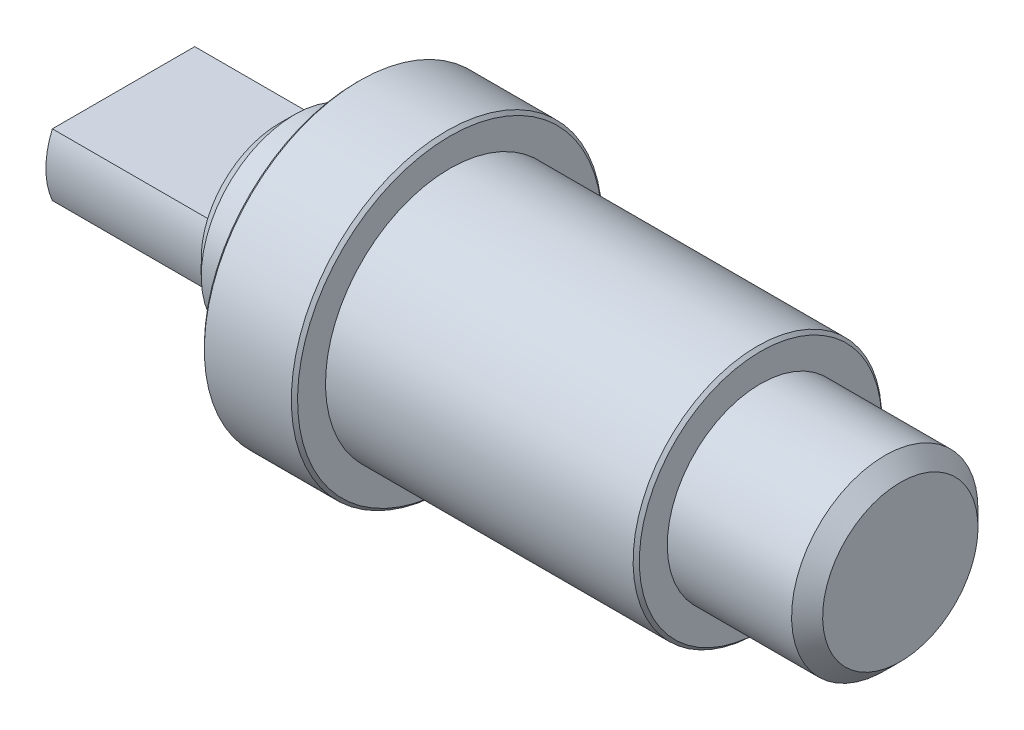
ISO-10303-21;
HEADER;
FILE_DESCRIPTION(('STEP AP214'),'2;1');
FILE_NAME('part.step','',(''),(''),'','','');
FILE_SCHEMA(('AUTOMOTIVE_DESIGN { 1 0 10303 214 1 1 1 1 }'));
ENDSEC;
DATA;
#1=APPLICATION_CONTEXT('core data for automotive mechanical design processes');
#2=APPLICATION_PROTOCOL_DEFINITION('international standard','automotive_design',2000,#1);
#3=PRODUCT_CONTEXT('',#1,'mechanical');
#4=PRODUCT('Part','Part','',(#3));
#5=PRODUCT_RELATED_PRODUCT_CATEGORY('part','',(#4));
#6=PRODUCT_DEFINITION_FORMATION('','',#4);
#7=PRODUCT_DEFINITION_CONTEXT('part definition',#1,'design');
#8=PRODUCT_DEFINITION('design','',#6,#7);
#9=PRODUCT_DEFINITION_SHAPE('','',#8);
#10=(LENGTH_UNIT() NAMED_UNIT(*) SI_UNIT(.MILLI.,.METRE.));
#11=(NAMED_UNIT(*) PLANE_ANGLE_UNIT() SI_UNIT($,.RADIAN.));
#12=(NAMED_UNIT(*) SI_UNIT($,.STERADIAN.) SOLID_ANGLE_UNIT());
#13=UNCERTAINTY_MEASURE_WITH_UNIT(LENGTH_MEASURE(1.E-05),#10,'distance_accuracy_value','');
#14=(GEOMETRIC_REPRESENTATION_CONTEXT(3) GLOBAL_UNCERTAINTY_ASSIGNED_CONTEXT((#13)) GLOBAL_UNIT_ASSIGNED_CONTEXT((#10,
#11,#12)) REPRESENTATION_CONTEXT('',''));
#15=CARTESIAN_POINT('',(0.,0.,0.));
#16=DIRECTION('',(0.,0.,1.));
#17=DIRECTION('',(1.,0.,0.));
#18=AXIS2_PLACEMENT_3D('',#15,#16,#17);
#19=CARTESIAN_POINT('',(0.,0.,0.));
#20=DIRECTION('',(1.,0.,0.));
#21=DIRECTION('',(0.,1.,0.));
#22=AXIS2_PLACEMENT_3D('',#19,#20,#21);
#23=PLANE('',#22);
#24=CARTESIAN_POINT('',(0.,0.,0.));
#25=DIRECTION('',(1.,0.,0.));
#26=DIRECTION('',(0.,1.,0.));
#27=AXIS2_PLACEMENT_3D('',#24,#25,#26);
#28=CIRCLE('',#27,2.5);
#29=CARTESIAN_POINT('',(0.,1.,-2.29128784747792));
#30=VERTEX_POINT('',#29);
#31=CARTESIAN_POINT('',(0.,1.,2.29128784747792));
#32=VERTEX_POINT('',#31);
#33=EDGE_CURVE('E44',#30,#32,#28,.T.);
#34=ORIENTED_EDGE('',*,*,#33,.F.);
#35=DIRECTION('',(0.,0.,1.));
#36=VECTOR('',#35,1.);
#37=CARTESIAN_POINT('',(0.,1.,0.));
#38=LINE('',#37,#36);
#39=EDGE_CURVE('E101',#30,#32,#38,.T.);
#40=ORIENTED_EDGE('',*,*,#39,.T.);
#41=EDGE_LOOP('',(#34,#40));
#42=FACE_BOUND('',#41,.T.);
#43=ADVANCED_FACE('F35',(#42),#23,.F.);
#44=CARTESIAN_POINT('',(0.,-1.,2.29128784747792));
#45=VERTEX_POINT('',#44);
#46=CARTESIAN_POINT('',(0.,-1.,-2.29128784747792));
#47=VERTEX_POINT('',#46);
#48=EDGE_CURVE('E43',#45,#47,#28,.T.);
#49=ORIENTED_EDGE('',*,*,#48,.F.);
#50=DIRECTION('',(0.,0.,-1.));
#51=VECTOR('',#50,1.);
#52=CARTESIAN_POINT('',(0.,-1.,0.));
#53=LINE('',#52,#51);
#54=EDGE_CURVE('E91',#45,#47,#53,.T.);
#55=ORIENTED_EDGE('',*,*,#54,.T.);
#56=EDGE_LOOP('',(#49,#55));
#57=FACE_BOUND('',#56,.T.);
#58=ADVANCED_FACE('F37',(#57),#23,.F.);
#59=CARTESIAN_POINT('',(0.5,0.,0.));
#60=DIRECTION('',(1.,0.,0.));
#61=DIRECTION('',(0.,1.,0.));
#62=AXIS2_PLACEMENT_3D('',#59,#60,#61);
#63=CONICAL_SURFACE('',#62,3.,0.785398163397448);
#64=EDGE_CURVE('E11',#32,#45,#28,.T.);
#65=ORIENTED_EDGE('',*,*,#64,.T.);
#66=ORIENTED_EDGE('',*,*,#48,.T.);
#67=CARTESIAN_POINT('',(0.,0.,0.));
#68=DIRECTION('',(1.,0.,0.));
#69=DIRECTION('',(0.,0.,-1.));
#70=AXIS2_PLACEMENT_3D('',#67,#68,#69);
#71=CIRCLE('',#70,2.5);
#72=EDGE_CURVE('E51',#47,#30,#71,.T.);
#73=ORIENTED_EDGE('',*,*,#72,.T.);
#74=ORIENTED_EDGE('',*,*,#33,.T.);
#75=EDGE_LOOP('',(#65,#66,#73,#74));
#76=FACE_BOUND('',#75,.T.);
#77=CARTESIAN_POINT('',(0.5,0.,0.));
#78=DIRECTION('',(1.,0.,0.));
#79=DIRECTION('',(0.,1.,0.));
#80=AXIS2_PLACEMENT_3D('',#77,#78,#79);
#81=CIRCLE('',#80,3.);
#82=CARTESIAN_POINT('',(0.500000000000001,3.,0.));
#83=VERTEX_POINT('',#82);
#84=EDGE_CURVE('E144',#83,#83,#81,.T.);
#85=ORIENTED_EDGE('',*,*,#84,.F.);
#86=EDGE_LOOP('',(#85));
#87=FACE_BOUND('',#86,.T.);
#88=ADVANCED_FACE('F152',(#76,#87),#63,.T.);
#89=CARTESIAN_POINT('',(20.,0.,0.));
#90=DIRECTION('',(1.,0.,0.));
#91=DIRECTION('',(0.,1.,0.));
#92=AXIS2_PLACEMENT_3D('',#89,#90,#91);
#93=CYLINDRICAL_SURFACE('',#92,3.);
#94=ORIENTED_EDGE('',*,*,#84,.T.);
#95=EDGE_LOOP('',(#94));
#96=FACE_BOUND('',#95,.T.);
#97=CARTESIAN_POINT('',(2.5,0.,0.));
#98=DIRECTION('',(1.,0.,0.));
#99=DIRECTION('',(0.,1.,0.));
#100=AXIS2_PLACEMENT_3D('',#97,#98,#99);
#101=CIRCLE('',#100,3.);
#102=CARTESIAN_POINT('',(2.5,3.,0.));
#103=VERTEX_POINT('',#102);
#104=EDGE_CURVE('E142',#103,#103,#101,.T.);
#105=ORIENTED_EDGE('',*,*,#104,.F.);
#106=EDGE_LOOP('',(#105));
#107=FACE_BOUND('',#106,.T.);
#108=ADVANCED_FACE('F160',(#96,#107),#93,.T.);
#109=CARTESIAN_POINT('',(2.5,4.9,0.));
#110=DIRECTION('',(-1.,0.,0.));
#111=DIRECTION('',(0.,-1.,0.));
#112=AXIS2_PLACEMENT_3D('',#109,#110,#111);
#113=PLANE('',#112);
#114=ORIENTED_EDGE('',*,*,#104,.T.);
#115=EDGE_LOOP('',(#114));
#116=FACE_BOUND('',#115,.T.);
#117=CARTESIAN_POINT('',(2.5,0.,0.));
#118=DIRECTION('',(1.,0.,0.));
#119=DIRECTION('',(0.,1.,0.));
#120=AXIS2_PLACEMENT_3D('',#117,#118,#119);
#121=CIRCLE('',#120,4.9);
#122=CARTESIAN_POINT('',(2.5,4.9,0.));
#123=VERTEX_POINT('',#122);
#124=EDGE_CURVE('E139',#123,#123,#121,.T.);
#125=ORIENTED_EDGE('',*,*,#124,.F.);
#126=EDGE_LOOP('',(#125));
#127=FACE_BOUND('',#126,.T.);
#128=ADVANCED_FACE('F218',(#116,#127),#113,.T.);
#129=CARTESIAN_POINT('',(2.6,0.,0.));
#130=DIRECTION('',(1.,0.,0.));
#131=DIRECTION('',(0.,1.,0.));
#132=AXIS2_PLACEMENT_3D('',#129,#130,#131);
#133=CONICAL_SURFACE('',#132,5.,0.785398163397435);
#134=ORIENTED_EDGE('',*,*,#124,.T.);
#135=EDGE_LOOP('',(#134));
#136=FACE_BOUND('',#135,.T.);
#137=CARTESIAN_POINT('',(2.6,0.,0.));
#138=DIRECTION('',(1.,0.,0.));
#139=DIRECTION('',(0.,1.,0.));
#140=AXIS2_PLACEMENT_3D('',#137,#138,#139);
#141=CIRCLE('',#140,5.);
#142=CARTESIAN_POINT('',(2.6,5.,0.));
#143=VERTEX_POINT('',#142);
#144=EDGE_CURVE('E136',#143,#143,#141,.T.);
#145=ORIENTED_EDGE('',*,*,#144,.F.);
#146=EDGE_LOOP('',(#145));
#147=FACE_BOUND('',#146,.T.);
#148=ADVANCED_FACE('F214',(#136,#147),#133,.T.);
#149=CARTESIAN_POINT('',(20.,0.,0.));
#150=DIRECTION('',(1.,0.,0.));
#151=DIRECTION('',(0.,1.,0.));
#152=AXIS2_PLACEMENT_3D('',#149,#150,#151);
#153=CYLINDRICAL_SURFACE('',#152,5.);
#154=ORIENTED_EDGE('',*,*,#144,.T.);
#155=EDGE_LOOP('',(#154));
#156=FACE_BOUND('',#155,.T.);
#157=CARTESIAN_POINT('',(5.4,0.,0.));
#158=DIRECTION('',(1.,0.,0.));
#159=DIRECTION('',(0.,1.,0.));
#160=AXIS2_PLACEMENT_3D('',#157,#158,#159);
#161=CIRCLE('',#160,5.);
#162=CARTESIAN_POINT('',(5.4,5.,0.));
#163=VERTEX_POINT('',#162);
#164=EDGE_CURVE('E133',#163,#163,#161,.T.);
#165=ORIENTED_EDGE('',*,*,#164,.F.);
#166=EDGE_LOOP('',(#165));
#167=FACE_BOUND('',#166,.T.);
#168=ADVANCED_FACE('F210',(#156,#167),#153,.T.);
#169=CARTESIAN_POINT('',(5.5,0.,0.));
#170=DIRECTION('',(-1.,0.,0.));
#171=DIRECTION('',(0.,-1.,0.));
#172=AXIS2_PLACEMENT_3D('',#169,#170,#171);
#173=CONICAL_SURFACE('',#172,4.9,0.785398163397448);
#174=ORIENTED_EDGE('',*,*,#164,.T.);
#175=EDGE_LOOP('',(#174));
#176=FACE_BOUND('',#175,.T.);
#177=CARTESIAN_POINT('',(5.5,0.,0.));
#178=DIRECTION('',(1.,0.,0.));
#179=DIRECTION('',(0.,1.,0.));
#180=AXIS2_PLACEMENT_3D('',#177,#178,#179);
#181=CIRCLE('',#180,4.9);
#182=CARTESIAN_POINT('',(5.5,4.9,0.));
#183=VERTEX_POINT('',#182);
#184=EDGE_CURVE('E130',#183,#183,#181,.T.);
#185=ORIENTED_EDGE('',*,*,#184,.F.);
#186=EDGE_LOOP('',(#185));
#187=FACE_BOUND('',#186,.T.);
#188=ADVANCED_FACE('F206',(#176,#187),#173,.T.);
#189=CARTESIAN_POINT('',(5.5,4.,0.));
#190=DIRECTION('',(1.,0.,0.));
#191=DIRECTION('',(0.,1.,0.));
#192=AXIS2_PLACEMENT_3D('',#189,#190,#191);
#193=PLANE('',#192);
#194=ORIENTED_EDGE('',*,*,#184,.T.);
#195=EDGE_LOOP('',(#194));
#196=FACE_BOUND('',#195,.T.);
#197=CARTESIAN_POINT('',(5.5,0.,0.));
#198=DIRECTION('',(1.,0.,0.));
#199=DIRECTION('',(0.,1.,0.));
#200=AXIS2_PLACEMENT_3D('',#197,#198,#199);
#201=CIRCLE('',#200,4.);
#202=CARTESIAN_POINT('',(5.5,4.,0.));
#203=VERTEX_POINT('',#202);
#204=EDGE_CURVE('E127',#203,#203,#201,.T.);
#205=ORIENTED_EDGE('',*,*,#204,.F.);
#206=EDGE_LOOP('',(#205));
#207=FACE_BOUND('',#206,.T.);
#208=ADVANCED_FACE('F202',(#196,#207),#193,.T.);
#209=CARTESIAN_POINT('',(20.,0.,0.));
#210=DIRECTION('',(1.,0.,0.));
#211=DIRECTION('',(0.,1.,0.));
#212=AXIS2_PLACEMENT_3D('',#209,#210,#211);
#213=CYLINDRICAL_SURFACE('',#212,4.);
#214=ORIENTED_EDGE('',*,*,#204,.T.);
#215=EDGE_LOOP('',(#214));
#216=FACE_BOUND('',#215,.T.);
#217=CARTESIAN_POINT('',(15.4,0.,0.));
#218=DIRECTION('',(1.,0.,0.));
#219=DIRECTION('',(0.,1.,0.));
#220=AXIS2_PLACEMENT_3D('',#217,#218,#219);
#221=CIRCLE('',#220,4.);
#222=CARTESIAN_POINT('',(15.4,4.,0.));
#223=VERTEX_POINT('',#222);
#224=EDGE_CURVE('E124',#223,#223,#221,.T.);
#225=ORIENTED_EDGE('',*,*,#224,.F.);
#226=EDGE_LOOP('',(#225));
#227=FACE_BOUND('',#226,.T.);
#228=ADVANCED_FACE('F198',(#216,#227),#213,.T.);
#229=CARTESIAN_POINT('',(15.5,0.,0.));
#230=DIRECTION('',(-1.,0.,0.));
#231=DIRECTION('',(0.,-1.,0.));
#232=AXIS2_PLACEMENT_3D('',#229,#230,#231);
#233=CONICAL_SURFACE('',#232,3.9,0.785398163397457);
#234=ORIENTED_EDGE('',*,*,#224,.T.);
#235=EDGE_LOOP('',(#234));
#236=FACE_BOUND('',#235,.T.);
#237=CARTESIAN_POINT('',(15.5,0.,0.));
#238=DIRECTION('',(1.,0.,0.));
#239=DIRECTION('',(0.,1.,0.));
#240=AXIS2_PLACEMENT_3D('',#237,#238,#239);
#241=CIRCLE('',#240,3.9);
#242=CARTESIAN_POINT('',(15.5,3.9,0.));
#243=VERTEX_POINT('',#242);
#244=EDGE_CURVE('E121',#243,#243,#241,.T.);
#245=ORIENTED_EDGE('',*,*,#244,.F.);
#246=EDGE_LOOP('',(#245));
#247=FACE_BOUND('',#246,.T.);
#248=ADVANCED_FACE('F194',(#236,#247),#233,.T.);
#249=CARTESIAN_POINT('',(15.5,3.,0.));
#250=DIRECTION('',(1.,0.,0.));
#251=DIRECTION('',(0.,1.,0.));
#252=AXIS2_PLACEMENT_3D('',#249,#250,#251);
#253=PLANE('',#252);
#254=ORIENTED_EDGE('',*,*,#244,.T.);
#255=EDGE_LOOP('',(#254));
#256=FACE_BOUND('',#255,.T.);
#257=CARTESIAN_POINT('',(15.5,0.,0.));
#258=DIRECTION('',(1.,0.,0.));
#259=DIRECTION('',(0.,1.,0.));
#260=AXIS2_PLACEMENT_3D('',#257,#258,#259);
#261=CIRCLE('',#260,3.);
#262=CARTESIAN_POINT('',(15.5,3.,0.));
#263=VERTEX_POINT('',#262);
#264=EDGE_CURVE('E118',#263,#263,#261,.T.);
#265=ORIENTED_EDGE('',*,*,#264,.F.);
#266=EDGE_LOOP('',(#265));
#267=FACE_BOUND('',#266,.T.);
#268=ADVANCED_FACE('F190',(#256,#267),#253,.T.);
#269=CARTESIAN_POINT('',(20.,0.,0.));
#270=DIRECTION('',(1.,0.,0.));
#271=DIRECTION('',(0.,1.,0.));
#272=AXIS2_PLACEMENT_3D('',#269,#270,#271);
#273=CYLINDRICAL_SURFACE('',#272,3.);
#274=ORIENTED_EDGE('',*,*,#264,.T.);
#275=EDGE_LOOP('',(#274));
#276=FACE_BOUND('',#275,.T.);
#277=CARTESIAN_POINT('',(19.5,0.,0.));
#278=DIRECTION('',(1.,0.,0.));
#279=DIRECTION('',(0.,1.,0.));
#280=AXIS2_PLACEMENT_3D('',#277,#278,#279);
#281=CIRCLE('',#280,3.);
#282=CARTESIAN_POINT('',(19.5,3.,0.));
#283=VERTEX_POINT('',#282);
#284=EDGE_CURVE('E115',#283,#283,#281,.T.);
#285=ORIENTED_EDGE('',*,*,#284,.F.);
#286=EDGE_LOOP('',(#285));
#287=FACE_BOUND('',#286,.T.);
#288=ADVANCED_FACE('F186',(#276,#287),#273,.T.);
#289=CARTESIAN_POINT('',(19.5,0.,0.));
#290=DIRECTION('',(-1.,0.,0.));
#291=DIRECTION('',(0.,-1.,0.));
#292=AXIS2_PLACEMENT_3D('',#289,#290,#291);
#293=CONICAL_SURFACE('',#292,3.,0.785398163397447);
#294=CARTESIAN_POINT('',(20.,0.,0.));
#295=DIRECTION('',(1.,0.,0.));
#296=DIRECTION('',(0.,1.,0.));
#297=AXIS2_PLACEMENT_3D('',#294,#295,#296);
#298=CIRCLE('',#297,2.5);
#299=CARTESIAN_POINT('',(20.,2.5,0.));
#300=VERTEX_POINT('',#299);
#301=EDGE_CURVE('E110',#300,#300,#298,.T.);
#302=ORIENTED_EDGE('',*,*,#301,.F.);
#303=EDGE_LOOP('',(#302));
#304=FACE_BOUND('',#303,.T.);
#305=ORIENTED_EDGE('',*,*,#284,.T.);
#306=EDGE_LOOP('',(#305));
#307=FACE_BOUND('',#306,.T.);
#308=ADVANCED_FACE('F182',(#304,#307),#293,.T.);
#309=CARTESIAN_POINT('',(20.,2.5,0.));
#310=DIRECTION('',(-1.,0.,0.));
#311=DIRECTION('',(0.,-1.,0.));
#312=AXIS2_PLACEMENT_3D('',#309,#310,#311);
#313=PLANE('',#312);
#314=ORIENTED_EDGE('',*,*,#301,.T.);
#315=EDGE_LOOP('',(#314));
#316=FACE_BOUND('',#315,.T.);
#317=ADVANCED_FACE('F174',(#316),#313,.F.);
#318=CARTESIAN_POINT('',(-5.,1.,0.));
#319=DIRECTION('',(0.,1.,0.));
#320=DIRECTION('',(0.,0.,1.));
#321=AXIS2_PLACEMENT_3D('',#318,#319,#320);
#322=PLANE('',#321);
#323=ORIENTED_EDGE('',*,*,#39,.F.);
#324=DIRECTION('',(1.,0.,0.));
#325=VECTOR('',#324,1.);
#326=CARTESIAN_POINT('',(-5.,1.,-2.29128784747792));
#327=LINE('',#326,#325);
#328=CARTESIAN_POINT('',(-5.,1.,-2.29128784747792));
#329=VERTEX_POINT('',#328);
#330=EDGE_CURVE('E75',#329,#30,#327,.T.);
#331=ORIENTED_EDGE('',*,*,#330,.F.);
#332=DIRECTION('',(0.,0.,1.));
#333=VECTOR('',#332,1.);
#334=CARTESIAN_POINT('',(-5.,1.,0.));
#335=LINE('',#334,#333);
#336=CARTESIAN_POINT('',(-5.,1.,2.29128784747792));
#337=VERTEX_POINT('',#336);
#338=EDGE_CURVE('E60',#329,#337,#335,.T.);
#339=ORIENTED_EDGE('',*,*,#338,.T.);
#340=DIRECTION('',(1.,0.,0.));
#341=VECTOR('',#340,1.);
#342=CARTESIAN_POINT('',(-5.,1.,2.29128784747792));
#343=LINE('',#342,#341);
#344=EDGE_CURVE('E82',#337,#32,#343,.T.);
#345=ORIENTED_EDGE('',*,*,#344,.T.);
#346=EDGE_LOOP('',(#323,#331,#339,#345));
#347=FACE_BOUND('',#346,.T.);
#348=ADVANCED_FACE('F165',(#347),#322,.T.);
#349=CARTESIAN_POINT('',(-5.,0.,0.));
#350=DIRECTION('',(1.,0.,0.));
#351=DIRECTION('',(0.,0.,-1.));
#352=AXIS2_PLACEMENT_3D('',#349,#350,#351);
#353=CYLINDRICAL_SURFACE('',#352,2.5);
#354=ORIENTED_EDGE('',*,*,#72,.F.);
#355=DIRECTION('',(1.,0.,0.));
#356=VECTOR('',#355,1.);
#357=CARTESIAN_POINT('',(-5.,-1.,-2.29128784747792));
#358=LINE('',#357,#356);
#359=CARTESIAN_POINT('',(-5.,-1.,-2.29128784747792));
#360=VERTEX_POINT('',#359);
#361=EDGE_CURVE('E93',#360,#47,#358,.T.);
#362=ORIENTED_EDGE('',*,*,#361,.F.);
#363=CARTESIAN_POINT('',(-5.,0.,0.));
#364=DIRECTION('',(1.,0.,0.));
#365=DIRECTION('',(0.,0.,-1.));
#366=AXIS2_PLACEMENT_3D('',#363,#364,#365);
#367=CIRCLE('',#366,2.5);
#368=EDGE_CURVE('E97',#360,#329,#367,.T.);
#369=ORIENTED_EDGE('',*,*,#368,.T.);
#370=ORIENTED_EDGE('',*,*,#330,.T.);
#371=EDGE_LOOP('',(#354,#362,#369,#370));
#372=FACE_BOUND('',#371,.T.);
#373=ADVANCED_FACE('F166',(#372),#353,.T.);
#374=CARTESIAN_POINT('',(-5.,-1.,0.));
#375=DIRECTION('',(0.,-1.,0.));
#376=DIRECTION('',(0.,0.,-1.));
#377=AXIS2_PLACEMENT_3D('',#374,#375,#376);
#378=PLANE('',#377);
#379=ORIENTED_EDGE('',*,*,#54,.F.);
#380=DIRECTION('',(1.,0.,0.));
#381=VECTOR('',#380,1.);
#382=CARTESIAN_POINT('',(-5.,-1.,2.29128784747792));
#383=LINE('',#382,#381);
#384=CARTESIAN_POINT('',(-5.,-1.,2.29128784747792));
#385=VERTEX_POINT('',#384);
#386=EDGE_CURVE('E86',#385,#45,#383,.T.);
#387=ORIENTED_EDGE('',*,*,#386,.F.);
#388=DIRECTION('',(0.,0.,-1.));
#389=VECTOR('',#388,1.);
#390=CARTESIAN_POINT('',(-5.,-1.,0.));
#391=LINE('',#390,#389);
#392=EDGE_CURVE('E89',#385,#360,#391,.T.);
#393=ORIENTED_EDGE('',*,*,#392,.T.);
#394=ORIENTED_EDGE('',*,*,#361,.T.);
#395=EDGE_LOOP('',(#379,#387,#393,#394));
#396=FACE_BOUND('',#395,.T.);
#397=ADVANCED_FACE('F88',(#396),#378,.T.);
#398=CARTESIAN_POINT('',(-5.,0.,0.));
#399=DIRECTION('',(1.,0.,0.));
#400=DIRECTION('',(0.,0.,-1.));
#401=AXIS2_PLACEMENT_3D('',#398,#399,#400);
#402=CYLINDRICAL_SURFACE('',#401,2.5);
#403=ORIENTED_EDGE('',*,*,#64,.F.);
#404=ORIENTED_EDGE('',*,*,#344,.F.);
#405=CARTESIAN_POINT('',(-5.,0.,0.));
#406=DIRECTION('',(1.,0.,0.));
#407=DIRECTION('',(0.,0.,-1.));
#408=AXIS2_PLACEMENT_3D('',#405,#406,#407);
#409=CIRCLE('',#408,2.5);
#410=EDGE_CURVE('E96',#337,#385,#409,.T.);
#411=ORIENTED_EDGE('',*,*,#410,.T.);
#412=ORIENTED_EDGE('',*,*,#386,.T.);
#413=EDGE_LOOP('',(#403,#404,#411,#412));
#414=FACE_BOUND('',#413,.T.);
#415=ADVANCED_FACE('F99',(#414),#402,.T.);
#416=CARTESIAN_POINT('',(-5.,0.,0.));
#417=DIRECTION('',(1.,0.,0.));
#418=DIRECTION('',(0.,0.,-1.));
#419=AXIS2_PLACEMENT_3D('',#416,#417,#418);
#420=PLANE('',#419);
#421=ORIENTED_EDGE('',*,*,#338,.F.);
#422=ORIENTED_EDGE('',*,*,#368,.F.);
#423=ORIENTED_EDGE('',*,*,#392,.F.);
#424=ORIENTED_EDGE('',*,*,#410,.F.);
#425=EDGE_LOOP('',(#421,#422,#423,#424));
#426=FACE_BOUND('',#425,.T.);
#427=ADVANCED_FACE('F95',(#426),#420,.F.);
#428=CLOSED_SHELL('',(#43,#58,#88,#108,#128,#148,#168,#188,#208,#228,#248,#268,#288,#308,#317,
#348,#373,#397,#415,#427));
#429=MANIFOLD_SOLID_BREP('B2',#428);
#430=ADVANCED_BREP_SHAPE_REPRESENTATION('',(#18,#429),#14);
#431=SHAPE_DEFINITION_REPRESENTATION(#9,#430);
ENDSEC;
END-ISO-10303-21;
